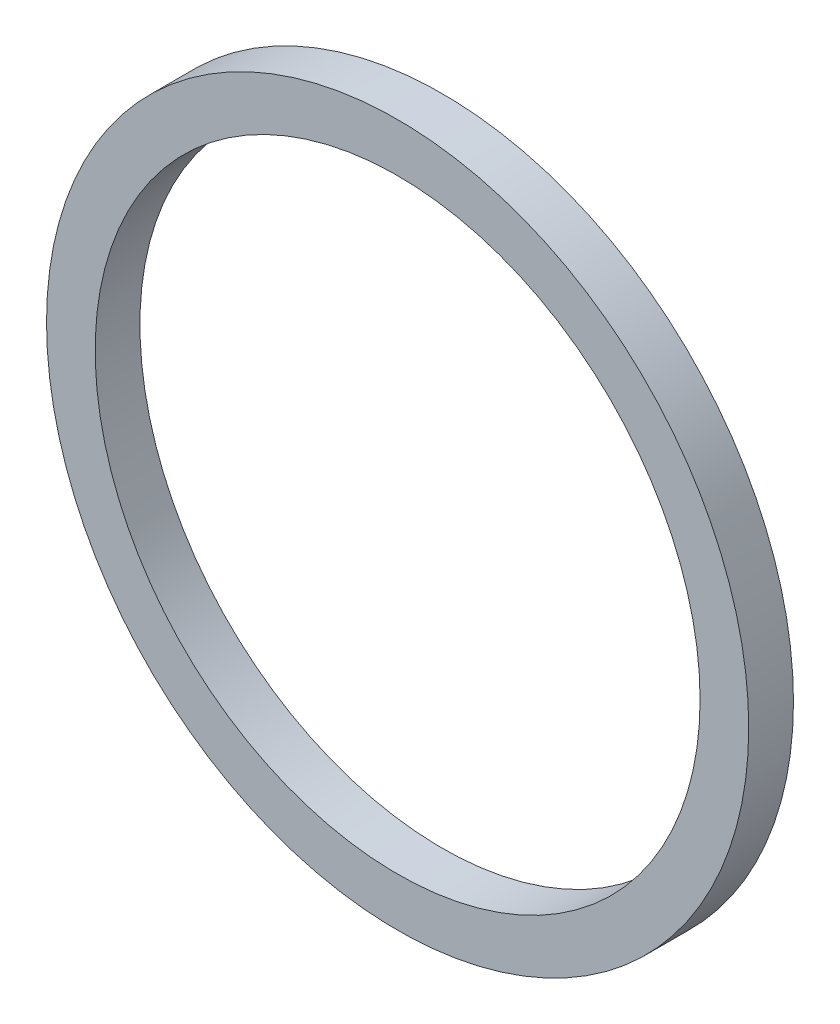
ISO-10303-21;
HEADER;
FILE_DESCRIPTION(('STEP AP214'),'2;1');
FILE_NAME('part.step','',(''),(''),'','','');
FILE_SCHEMA(('AUTOMOTIVE_DESIGN { 1 0 10303 214 1 1 1 1 }'));
ENDSEC;
DATA;
#1=APPLICATION_CONTEXT('core data for automotive mechanical design processes');
#2=APPLICATION_PROTOCOL_DEFINITION('international standard','automotive_design',2000,#1);
#3=PRODUCT_CONTEXT('',#1,'mechanical');
#4=PRODUCT('Part','Part','',(#3));
#5=PRODUCT_RELATED_PRODUCT_CATEGORY('part','',(#4));
#6=PRODUCT_DEFINITION_FORMATION('','',#4);
#7=PRODUCT_DEFINITION_CONTEXT('part definition',#1,'design');
#8=PRODUCT_DEFINITION('design','',#6,#7);
#9=PRODUCT_DEFINITION_SHAPE('','',#8);
#10=(LENGTH_UNIT() NAMED_UNIT(*) SI_UNIT(.MILLI.,.METRE.));
#11=(NAMED_UNIT(*) PLANE_ANGLE_UNIT() SI_UNIT($,.RADIAN.));
#12=(NAMED_UNIT(*) SI_UNIT($,.STERADIAN.) SOLID_ANGLE_UNIT());
#13=UNCERTAINTY_MEASURE_WITH_UNIT(LENGTH_MEASURE(1.E-05),#10,'distance_accuracy_value','');
#14=(GEOMETRIC_REPRESENTATION_CONTEXT(3) GLOBAL_UNCERTAINTY_ASSIGNED_CONTEXT((#13)) GLOBAL_UNIT_ASSIGNED_CONTEXT((#10,
#11,#12)) REPRESENTATION_CONTEXT('',''));
#15=CARTESIAN_POINT('',(0.,0.,0.));
#16=DIRECTION('',(0.,0.,1.));
#17=DIRECTION('',(1.,0.,0.));
#18=AXIS2_PLACEMENT_3D('',#15,#16,#17);
#19=CARTESIAN_POINT('',(0.,0.,5.842));
#20=DIRECTION('',(0.,0.,1.));
#21=DIRECTION('',(1.,0.,0.));
#22=AXIS2_PLACEMENT_3D('',#19,#20,#21);
#23=PLANE('',#22);
#24=CARTESIAN_POINT('',(0.,0.,5.842));
#25=DIRECTION('',(0.,0.,1.));
#26=DIRECTION('',(1.,0.,0.));
#27=AXIS2_PLACEMENT_3D('',#24,#25,#26);
#28=CIRCLE('',#27,45.837475);
#29=CARTESIAN_POINT('',(45.837475,0.,5.842));
#30=VERTEX_POINT('',#29);
#31=EDGE_CURVE('E10',#30,#30,#28,.T.);
#32=ORIENTED_EDGE('',*,*,#31,.T.);
#33=EDGE_LOOP('',(#32));
#34=FACE_BOUND('',#33,.T.);
#35=CARTESIAN_POINT('',(0.,0.,5.842));
#36=DIRECTION('',(0.,0.,1.));
#37=DIRECTION('',(1.,0.,0.));
#38=AXIS2_PLACEMENT_3D('',#35,#36,#37);
#39=CIRCLE('',#38,39.487475);
#40=CARTESIAN_POINT('',(39.487475,0.,5.842));
#41=VERTEX_POINT('',#40);
#42=EDGE_CURVE('E42',#41,#41,#39,.T.);
#43=ORIENTED_EDGE('',*,*,#42,.F.);
#44=EDGE_LOOP('',(#43));
#45=FACE_BOUND('',#44,.T.);
#46=ADVANCED_FACE('F31',(#34,#45),#23,.T.);
#47=CARTESIAN_POINT('',(0.,0.,0.));
#48=DIRECTION('',(0.,0.,1.));
#49=DIRECTION('',(1.,0.,0.));
#50=AXIS2_PLACEMENT_3D('',#47,#48,#49);
#51=PLANE('',#50);
#52=CARTESIAN_POINT('',(0.,0.,0.));
#53=DIRECTION('',(0.,0.,1.));
#54=DIRECTION('',(1.,0.,0.));
#55=AXIS2_PLACEMENT_3D('',#52,#53,#54);
#56=CIRCLE('',#55,45.837475);
#57=CARTESIAN_POINT('',(45.837475,0.,0.));
#58=VERTEX_POINT('',#57);
#59=EDGE_CURVE('E35',#58,#58,#56,.T.);
#60=ORIENTED_EDGE('',*,*,#59,.F.);
#61=EDGE_LOOP('',(#60));
#62=FACE_BOUND('',#61,.T.);
#63=CARTESIAN_POINT('',(0.,0.,0.));
#64=DIRECTION('',(0.,0.,1.));
#65=DIRECTION('',(1.,0.,0.));
#66=AXIS2_PLACEMENT_3D('',#63,#64,#65);
#67=CIRCLE('',#66,39.487475);
#68=CARTESIAN_POINT('',(39.487475,0.,0.));
#69=VERTEX_POINT('',#68);
#70=EDGE_CURVE('E44',#69,#69,#67,.T.);
#71=ORIENTED_EDGE('',*,*,#70,.T.);
#72=EDGE_LOOP('',(#71));
#73=FACE_BOUND('',#72,.T.);
#74=ADVANCED_FACE('F54',(#62,#73),#51,.F.);
#75=CARTESIAN_POINT('',(0.,0.,5.842));
#76=DIRECTION('',(0.,0.,-1.));
#77=DIRECTION('',(-1.,0.,0.));
#78=AXIS2_PLACEMENT_3D('',#75,#76,#77);
#79=CYLINDRICAL_SURFACE('',#78,45.837475);
#80=ORIENTED_EDGE('',*,*,#31,.F.);
#81=EDGE_LOOP('',(#80));
#82=FACE_BOUND('',#81,.T.);
#83=ORIENTED_EDGE('',*,*,#59,.T.);
#84=EDGE_LOOP('',(#83));
#85=FACE_BOUND('',#84,.T.);
#86=ADVANCED_FACE('F33',(#82,#85),#79,.T.);
#87=CARTESIAN_POINT('',(0.,0.,5.842));
#88=DIRECTION('',(0.,0.,-1.));
#89=DIRECTION('',(-1.,0.,0.));
#90=AXIS2_PLACEMENT_3D('',#87,#88,#89);
#91=CYLINDRICAL_SURFACE('',#90,39.487475);
#92=ORIENTED_EDGE('',*,*,#42,.T.);
#93=EDGE_LOOP('',(#92));
#94=FACE_BOUND('',#93,.T.);
#95=ORIENTED_EDGE('',*,*,#70,.F.);
#96=EDGE_LOOP('',(#95));
#97=FACE_BOUND('',#96,.T.);
#98=ADVANCED_FACE('F50',(#94,#97),#91,.F.);
#99=CLOSED_SHELL('',(#46,#74,#86,#98));
#100=MANIFOLD_SOLID_BREP('B2',#99);
#101=ADVANCED_BREP_SHAPE_REPRESENTATION('',(#18,#100),#14);
#102=SHAPE_DEFINITION_REPRESENTATION(#9,#101);
ENDSEC;
END-ISO-10303-21;
